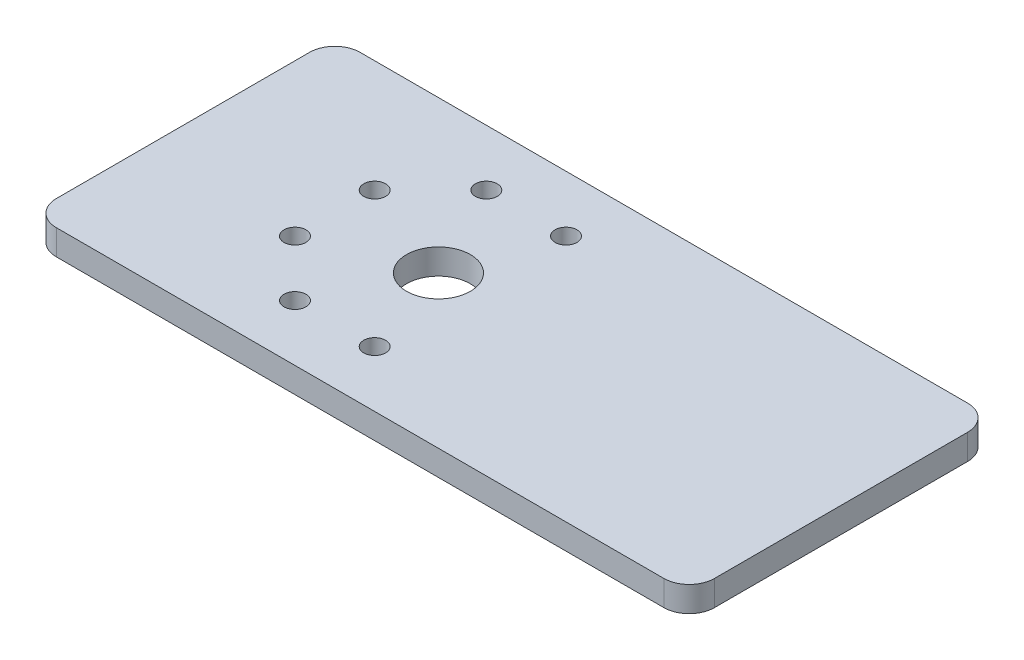
ISO-10303-21;
HEADER;
FILE_DESCRIPTION(('STEP AP214'),'2;1');
FILE_NAME('part.step','',(''),(''),'','','');
FILE_SCHEMA(('AUTOMOTIVE_DESIGN { 1 0 10303 214 1 1 1 1 }'));
ENDSEC;
DATA;
#1=APPLICATION_CONTEXT('core data for automotive mechanical design processes');
#2=APPLICATION_PROTOCOL_DEFINITION('international standard','automotive_design',2000,#1);
#3=PRODUCT_CONTEXT('',#1,'mechanical');
#4=PRODUCT('Part','Part','',(#3));
#5=PRODUCT_RELATED_PRODUCT_CATEGORY('part','',(#4));
#6=PRODUCT_DEFINITION_FORMATION('','',#4);
#7=PRODUCT_DEFINITION_CONTEXT('part definition',#1,'design');
#8=PRODUCT_DEFINITION('design','',#6,#7);
#9=PRODUCT_DEFINITION_SHAPE('','',#8);
#10=(LENGTH_UNIT() NAMED_UNIT(*) SI_UNIT(.MILLI.,.METRE.));
#11=(NAMED_UNIT(*) PLANE_ANGLE_UNIT() SI_UNIT($,.RADIAN.));
#12=(NAMED_UNIT(*) SI_UNIT($,.STERADIAN.) SOLID_ANGLE_UNIT());
#13=UNCERTAINTY_MEASURE_WITH_UNIT(LENGTH_MEASURE(1.E-05),#10,'distance_accuracy_value','');
#14=(GEOMETRIC_REPRESENTATION_CONTEXT(3) GLOBAL_UNCERTAINTY_ASSIGNED_CONTEXT((#13)) GLOBAL_UNIT_ASSIGNED_CONTEXT((#10,
#11,#12)) REPRESENTATION_CONTEXT('',''));
#15=CARTESIAN_POINT('',(0.,0.,0.));
#16=DIRECTION('',(0.,0.,1.));
#17=DIRECTION('',(1.,0.,0.));
#18=AXIS2_PLACEMENT_3D('',#15,#16,#17);
#19=CARTESIAN_POINT('',(82.55,6.35,-38.1));
#20=DIRECTION('',(-1.,0.,0.));
#21=DIRECTION('',(0.,0.,1.));
#22=AXIS2_PLACEMENT_3D('',#19,#20,#21);
#23=PLANE('',#22);
#24=DIRECTION('',(0.,0.,-1.));
#25=VECTOR('',#24,1.);
#26=CARTESIAN_POINT('',(82.55,0.,-38.1));
#27=LINE('',#26,#25);
#28=CARTESIAN_POINT('',(82.55,0.,31.75));
#29=VERTEX_POINT('',#28);
#30=CARTESIAN_POINT('',(82.55,0.,-31.75));
#31=VERTEX_POINT('',#30);
#32=EDGE_CURVE('E127',#29,#31,#27,.T.);
#33=ORIENTED_EDGE('',*,*,#32,.T.);
#34=DIRECTION('',(0.,-1.,0.));
#35=VECTOR('',#34,1.);
#36=CARTESIAN_POINT('',(82.55,6.35,-31.75));
#37=LINE('',#36,#35);
#38=CARTESIAN_POINT('',(82.55,6.35,-31.75));
#39=VERTEX_POINT('',#38);
#40=EDGE_CURVE('E163',#31,#39,#37,.F.);
#41=ORIENTED_EDGE('',*,*,#40,.T.);
#42=DIRECTION('',(0.,0.,-1.));
#43=VECTOR('',#42,1.);
#44=CARTESIAN_POINT('',(82.55,6.35,-38.1));
#45=LINE('',#44,#43);
#46=CARTESIAN_POINT('',(82.55,6.35,31.75));
#47=VERTEX_POINT('',#46);
#48=EDGE_CURVE('E125',#47,#39,#45,.T.);
#49=ORIENTED_EDGE('',*,*,#48,.F.);
#50=DIRECTION('',(0.,-1.,0.));
#51=VECTOR('',#50,1.);
#52=CARTESIAN_POINT('',(82.55,6.35,31.75));
#53=LINE('',#52,#51);
#54=EDGE_CURVE('E160',#47,#29,#53,.T.);
#55=ORIENTED_EDGE('',*,*,#54,.T.);
#56=EDGE_LOOP('',(#33,#41,#49,#55));
#57=FACE_BOUND('',#56,.T.);
#58=ADVANCED_FACE('F32',(#57),#23,.F.);
#59=CARTESIAN_POINT('',(-82.55,6.35,-38.1));
#60=DIRECTION('',(0.,0.,1.));
#61=DIRECTION('',(1.,0.,0.));
#62=AXIS2_PLACEMENT_3D('',#59,#60,#61);
#63=PLANE('',#62);
#64=DIRECTION('',(-1.,0.,0.));
#65=VECTOR('',#64,1.);
#66=CARTESIAN_POINT('',(-82.55,0.,-38.1));
#67=LINE('',#66,#65);
#68=CARTESIAN_POINT('',(76.2,0.,-38.1));
#69=VERTEX_POINT('',#68);
#70=CARTESIAN_POINT('',(-76.2,0.,-38.1));
#71=VERTEX_POINT('',#70);
#72=EDGE_CURVE('E123',#69,#71,#67,.T.);
#73=ORIENTED_EDGE('',*,*,#72,.T.);
#74=DIRECTION('',(0.,-1.,0.));
#75=VECTOR('',#74,1.);
#76=CARTESIAN_POINT('',(-76.2,6.35,-38.1));
#77=LINE('',#76,#75);
#78=CARTESIAN_POINT('',(-76.2,6.35,-38.1));
#79=VERTEX_POINT('',#78);
#80=EDGE_CURVE('E102',#71,#79,#77,.F.);
#81=ORIENTED_EDGE('',*,*,#80,.T.);
#82=DIRECTION('',(-1.,0.,0.));
#83=VECTOR('',#82,1.);
#84=CARTESIAN_POINT('',(-82.55,6.35,-38.1));
#85=LINE('',#84,#83);
#86=CARTESIAN_POINT('',(76.2,6.35,-38.1));
#87=VERTEX_POINT('',#86);
#88=EDGE_CURVE('E179',#87,#79,#85,.T.);
#89=ORIENTED_EDGE('',*,*,#88,.F.);
#90=DIRECTION('',(0.,-1.,0.));
#91=VECTOR('',#90,1.);
#92=CARTESIAN_POINT('',(76.2,6.35,-38.1));
#93=LINE('',#92,#91);
#94=EDGE_CURVE('E107',#87,#69,#93,.T.);
#95=ORIENTED_EDGE('',*,*,#94,.T.);
#96=EDGE_LOOP('',(#73,#81,#89,#95));
#97=FACE_BOUND('',#96,.T.);
#98=ADVANCED_FACE('F246',(#97),#63,.F.);
#99=CARTESIAN_POINT('',(-82.55,6.35,-38.1));
#100=DIRECTION('',(1.,0.,0.));
#101=DIRECTION('',(0.,0.,-1.));
#102=AXIS2_PLACEMENT_3D('',#99,#100,#101);
#103=PLANE('',#102);
#104=DIRECTION('',(0.,0.,1.));
#105=VECTOR('',#104,1.);
#106=CARTESIAN_POINT('',(-82.55,6.35,-38.1));
#107=LINE('',#106,#105);
#108=CARTESIAN_POINT('',(-82.55,6.35,-31.75));
#109=VERTEX_POINT('',#108);
#110=CARTESIAN_POINT('',(-82.55,6.35,31.75));
#111=VERTEX_POINT('',#110);
#112=EDGE_CURVE('E116',#109,#111,#107,.T.);
#113=ORIENTED_EDGE('',*,*,#112,.F.);
#114=DIRECTION('',(0.,-1.,0.));
#115=VECTOR('',#114,1.);
#116=CARTESIAN_POINT('',(-82.55,6.35,-31.75));
#117=LINE('',#116,#115);
#118=CARTESIAN_POINT('',(-82.55,0.,-31.75));
#119=VERTEX_POINT('',#118);
#120=EDGE_CURVE('E101',#109,#119,#117,.T.);
#121=ORIENTED_EDGE('',*,*,#120,.T.);
#122=DIRECTION('',(0.,0.,1.));
#123=VECTOR('',#122,1.);
#124=CARTESIAN_POINT('',(-82.55,0.,-38.1));
#125=LINE('',#124,#123);
#126=CARTESIAN_POINT('',(-82.55,0.,31.75));
#127=VERTEX_POINT('',#126);
#128=EDGE_CURVE('E114',#119,#127,#125,.T.);
#129=ORIENTED_EDGE('',*,*,#128,.T.);
#130=DIRECTION('',(0.,-1.,0.));
#131=VECTOR('',#130,1.);
#132=CARTESIAN_POINT('',(-82.55,6.35,31.75));
#133=LINE('',#132,#131);
#134=EDGE_CURVE('E118',#127,#111,#133,.F.);
#135=ORIENTED_EDGE('',*,*,#134,.T.);
#136=EDGE_LOOP('',(#113,#121,#129,#135));
#137=FACE_BOUND('',#136,.T.);
#138=ADVANCED_FACE('F113',(#137),#103,.F.);
#139=CARTESIAN_POINT('',(-82.55,6.35,38.1));
#140=DIRECTION('',(0.,0.,-1.));
#141=DIRECTION('',(-1.,0.,0.));
#142=AXIS2_PLACEMENT_3D('',#139,#140,#141);
#143=PLANE('',#142);
#144=DIRECTION('',(1.,0.,0.));
#145=VECTOR('',#144,1.);
#146=CARTESIAN_POINT('',(-82.55,0.,38.1));
#147=LINE('',#146,#145);
#148=CARTESIAN_POINT('',(-76.2,0.,38.1));
#149=VERTEX_POINT('',#148);
#150=CARTESIAN_POINT('',(76.2,0.,38.1));
#151=VERTEX_POINT('',#150);
#152=EDGE_CURVE('E122',#149,#151,#147,.T.);
#153=ORIENTED_EDGE('',*,*,#152,.T.);
#154=DIRECTION('',(0.,-1.,0.));
#155=VECTOR('',#154,1.);
#156=CARTESIAN_POINT('',(76.2,6.35,38.1));
#157=LINE('',#156,#155);
#158=CARTESIAN_POINT('',(76.2,6.35,38.1));
#159=VERTEX_POINT('',#158);
#160=EDGE_CURVE('E11',#151,#159,#157,.F.);
#161=ORIENTED_EDGE('',*,*,#160,.T.);
#162=DIRECTION('',(1.,0.,0.));
#163=VECTOR('',#162,1.);
#164=CARTESIAN_POINT('',(-82.55,6.35,38.1));
#165=LINE('',#164,#163);
#166=CARTESIAN_POINT('',(-76.2,6.35,38.1));
#167=VERTEX_POINT('',#166);
#168=EDGE_CURVE('E144',#167,#159,#165,.T.);
#169=ORIENTED_EDGE('',*,*,#168,.F.);
#170=DIRECTION('',(0.,-1.,0.));
#171=VECTOR('',#170,1.);
#172=CARTESIAN_POINT('',(-76.2,6.35,38.1));
#173=LINE('',#172,#171);
#174=EDGE_CURVE('E40',#167,#149,#173,.T.);
#175=ORIENTED_EDGE('',*,*,#174,.T.);
#176=EDGE_LOOP('',(#153,#161,#169,#175));
#177=FACE_BOUND('',#176,.T.);
#178=ADVANCED_FACE('F166',(#177),#143,.F.);
#179=CARTESIAN_POINT('',(0.,6.35,0.));
#180=DIRECTION('',(0.,1.,0.));
#181=DIRECTION('',(0.,0.,1.));
#182=AXIS2_PLACEMENT_3D('',#179,#180,#181);
#183=PLANE('',#182);
#184=CARTESIAN_POINT('',(-18.45,6.35,0.));
#185=DIRECTION('',(0.,1.,0.));
#186=DIRECTION('',(0.,0.,1.));
#187=AXIS2_PLACEMENT_3D('',#184,#185,#186);
#188=CIRCLE('',#187,8.);
#189=CARTESIAN_POINT('',(-18.45,6.35,8.));
#190=VERTEX_POINT('',#189);
#191=EDGE_CURVE('E214',#190,#190,#188,.T.);
#192=ORIENTED_EDGE('',*,*,#191,.F.);
#193=EDGE_LOOP('',(#192));
#194=FACE_BOUND('',#193,.T.);
#195=CARTESIAN_POINT('',(-44.45,6.35,-10.));
#196=DIRECTION('',(0.,1.,0.));
#197=DIRECTION('',(0.,0.,1.));
#198=AXIS2_PLACEMENT_3D('',#195,#196,#197);
#199=CIRCLE('',#198,2.75);
#200=CARTESIAN_POINT('',(-44.45,6.35,-7.25));
#201=VERTEX_POINT('',#200);
#202=EDGE_CURVE('E210',#201,#201,#199,.T.);
#203=ORIENTED_EDGE('',*,*,#202,.F.);
#204=EDGE_LOOP('',(#203));
#205=FACE_BOUND('',#204,.T.);
#206=CARTESIAN_POINT('',(-44.45,6.35,10.));
#207=DIRECTION('',(0.,1.,0.));
#208=DIRECTION('',(0.,0.,1.));
#209=AXIS2_PLACEMENT_3D('',#206,#207,#208);
#210=CIRCLE('',#209,2.75);
#211=CARTESIAN_POINT('',(-44.45,6.35,12.75));
#212=VERTEX_POINT('',#211);
#213=EDGE_CURVE('E204',#212,#212,#210,.T.);
#214=ORIENTED_EDGE('',*,*,#213,.F.);
#215=EDGE_LOOP('',(#214));
#216=FACE_BOUND('',#215,.T.);
#217=CARTESIAN_POINT('',(-10.45,6.35,-23.999999994));
#218=DIRECTION('',(0.,1.,0.));
#219=DIRECTION('',(0.,0.,1.));
#220=AXIS2_PLACEMENT_3D('',#217,#218,#219);
#221=CIRCLE('',#220,2.75);
#222=CARTESIAN_POINT('',(-10.45,6.35,-21.249999994));
#223=VERTEX_POINT('',#222);
#224=EDGE_CURVE('E143',#223,#223,#221,.T.);
#225=ORIENTED_EDGE('',*,*,#224,.F.);
#226=EDGE_LOOP('',(#225));
#227=FACE_BOUND('',#226,.T.);
#228=CARTESIAN_POINT('',(-10.45,6.35,24.000000006));
#229=DIRECTION('',(0.,1.,0.));
#230=DIRECTION('',(0.,0.,1.));
#231=AXIS2_PLACEMENT_3D('',#228,#229,#230);
#232=CIRCLE('',#231,2.75);
#233=CARTESIAN_POINT('',(-10.45,6.35,26.750000006));
#234=VERTEX_POINT('',#233);
#235=EDGE_CURVE('E139',#234,#234,#232,.T.);
#236=ORIENTED_EDGE('',*,*,#235,.F.);
#237=EDGE_LOOP('',(#236));
#238=FACE_BOUND('',#237,.T.);
#239=CARTESIAN_POINT('',(-30.45,6.35,-23.999999994));
#240=DIRECTION('',(0.,1.,0.));
#241=DIRECTION('',(0.,0.,1.));
#242=AXIS2_PLACEMENT_3D('',#239,#240,#241);
#243=CIRCLE('',#242,2.75);
#244=CARTESIAN_POINT('',(-30.45,6.35,-21.249999994));
#245=VERTEX_POINT('',#244);
#246=EDGE_CURVE('E135',#245,#245,#243,.T.);
#247=ORIENTED_EDGE('',*,*,#246,.F.);
#248=EDGE_LOOP('',(#247));
#249=FACE_BOUND('',#248,.T.);
#250=CARTESIAN_POINT('',(-30.45,6.35,24.000000006));
#251=DIRECTION('',(0.,1.,0.));
#252=DIRECTION('',(0.,0.,1.));
#253=AXIS2_PLACEMENT_3D('',#250,#251,#252);
#254=CIRCLE('',#253,2.75);
#255=CARTESIAN_POINT('',(-30.45,6.35,26.750000006));
#256=VERTEX_POINT('',#255);
#257=EDGE_CURVE('E134',#256,#256,#254,.T.);
#258=ORIENTED_EDGE('',*,*,#257,.F.);
#259=EDGE_LOOP('',(#258));
#260=FACE_BOUND('',#259,.T.);
#261=ORIENTED_EDGE('',*,*,#88,.T.);
#262=CARTESIAN_POINT('',(-76.2,6.35,-31.75));
#263=DIRECTION('',(0.,1.,0.));
#264=DIRECTION('',(0.,0.,1.));
#265=AXIS2_PLACEMENT_3D('',#262,#263,#264);
#266=CIRCLE('',#265,6.35);
#267=EDGE_CURVE('E158',#79,#109,#266,.T.);
#268=ORIENTED_EDGE('',*,*,#267,.T.);
#269=ORIENTED_EDGE('',*,*,#112,.T.);
#270=CARTESIAN_POINT('',(-76.2,6.35,31.75));
#271=DIRECTION('',(0.,1.,0.));
#272=DIRECTION('',(0.,0.,1.));
#273=AXIS2_PLACEMENT_3D('',#270,#271,#272);
#274=CIRCLE('',#273,6.35);
#275=EDGE_CURVE('E52',#111,#167,#274,.T.);
#276=ORIENTED_EDGE('',*,*,#275,.T.);
#277=ORIENTED_EDGE('',*,*,#168,.T.);
#278=CARTESIAN_POINT('',(76.2,6.35,31.75));
#279=DIRECTION('',(0.,1.,0.));
#280=DIRECTION('',(0.,0.,1.));
#281=AXIS2_PLACEMENT_3D('',#278,#279,#280);
#282=CIRCLE('',#281,6.35);
#283=EDGE_CURVE('E154',#159,#47,#282,.T.);
#284=ORIENTED_EDGE('',*,*,#283,.T.);
#285=ORIENTED_EDGE('',*,*,#48,.T.);
#286=CARTESIAN_POINT('',(76.2,6.35,-31.75));
#287=DIRECTION('',(0.,1.,0.));
#288=DIRECTION('',(0.,0.,1.));
#289=AXIS2_PLACEMENT_3D('',#286,#287,#288);
#290=CIRCLE('',#289,6.35);
#291=EDGE_CURVE('E156',#39,#87,#290,.T.);
#292=ORIENTED_EDGE('',*,*,#291,.T.);
#293=EDGE_LOOP('',(#261,#268,#269,#276,#277,#284,#285,#292));
#294=FACE_BOUND('',#293,.T.);
#295=ADVANCED_FACE('F229',(#194,#205,#216,#227,#238,#249,#260,#294),#183,.T.);
#296=CARTESIAN_POINT('',(0.,0.,0.));
#297=DIRECTION('',(0.,1.,0.));
#298=DIRECTION('',(0.,0.,1.));
#299=AXIS2_PLACEMENT_3D('',#296,#297,#298);
#300=PLANE('',#299);
#301=CARTESIAN_POINT('',(-18.45,0.,0.));
#302=DIRECTION('',(0.,1.,0.));
#303=DIRECTION('',(0.,0.,1.));
#304=AXIS2_PLACEMENT_3D('',#301,#302,#303);
#305=CIRCLE('',#304,8.);
#306=CARTESIAN_POINT('',(-18.45,0.,8.));
#307=VERTEX_POINT('',#306);
#308=EDGE_CURVE('E213',#307,#307,#305,.T.);
#309=ORIENTED_EDGE('',*,*,#308,.T.);
#310=EDGE_LOOP('',(#309));
#311=FACE_BOUND('',#310,.T.);
#312=CARTESIAN_POINT('',(-44.45,0.,-10.));
#313=DIRECTION('',(0.,1.,0.));
#314=DIRECTION('',(0.,0.,1.));
#315=AXIS2_PLACEMENT_3D('',#312,#313,#314);
#316=CIRCLE('',#315,2.75);
#317=CARTESIAN_POINT('',(-44.45,0.,-7.25));
#318=VERTEX_POINT('',#317);
#319=EDGE_CURVE('E207',#318,#318,#316,.T.);
#320=ORIENTED_EDGE('',*,*,#319,.T.);
#321=EDGE_LOOP('',(#320));
#322=FACE_BOUND('',#321,.T.);
#323=CARTESIAN_POINT('',(-44.45,0.,10.));
#324=DIRECTION('',(0.,1.,0.));
#325=DIRECTION('',(0.,0.,1.));
#326=AXIS2_PLACEMENT_3D('',#323,#324,#325);
#327=CIRCLE('',#326,2.75);
#328=CARTESIAN_POINT('',(-44.45,0.,12.75));
#329=VERTEX_POINT('',#328);
#330=EDGE_CURVE('E201',#329,#329,#327,.T.);
#331=ORIENTED_EDGE('',*,*,#330,.T.);
#332=EDGE_LOOP('',(#331));
#333=FACE_BOUND('',#332,.T.);
#334=CARTESIAN_POINT('',(-10.45,0.,-23.999999994));
#335=DIRECTION('',(0.,1.,0.));
#336=DIRECTION('',(0.,0.,1.));
#337=AXIS2_PLACEMENT_3D('',#334,#335,#336);
#338=CIRCLE('',#337,2.75);
#339=CARTESIAN_POINT('',(-10.45,0.,-21.249999994));
#340=VERTEX_POINT('',#339);
#341=EDGE_CURVE('E140',#340,#340,#338,.T.);
#342=ORIENTED_EDGE('',*,*,#341,.T.);
#343=EDGE_LOOP('',(#342));
#344=FACE_BOUND('',#343,.T.);
#345=CARTESIAN_POINT('',(-10.45,0.,24.000000006));
#346=DIRECTION('',(0.,1.,0.));
#347=DIRECTION('',(0.,0.,1.));
#348=AXIS2_PLACEMENT_3D('',#345,#346,#347);
#349=CIRCLE('',#348,2.75);
#350=CARTESIAN_POINT('',(-10.45,0.,26.750000006));
#351=VERTEX_POINT('',#350);
#352=EDGE_CURVE('E136',#351,#351,#349,.T.);
#353=ORIENTED_EDGE('',*,*,#352,.T.);
#354=EDGE_LOOP('',(#353));
#355=FACE_BOUND('',#354,.T.);
#356=CARTESIAN_POINT('',(-30.45,0.,-23.999999994));
#357=DIRECTION('',(0.,1.,0.));
#358=DIRECTION('',(0.,0.,1.));
#359=AXIS2_PLACEMENT_3D('',#356,#357,#358);
#360=CIRCLE('',#359,2.75);
#361=CARTESIAN_POINT('',(-30.45,0.,-21.249999994));
#362=VERTEX_POINT('',#361);
#363=EDGE_CURVE('E131',#362,#362,#360,.T.);
#364=ORIENTED_EDGE('',*,*,#363,.T.);
#365=EDGE_LOOP('',(#364));
#366=FACE_BOUND('',#365,.T.);
#367=CARTESIAN_POINT('',(-30.45,0.,24.000000006));
#368=DIRECTION('',(0.,1.,0.));
#369=DIRECTION('',(0.,0.,1.));
#370=AXIS2_PLACEMENT_3D('',#367,#368,#369);
#371=CIRCLE('',#370,2.75);
#372=CARTESIAN_POINT('',(-30.45,0.,26.750000006));
#373=VERTEX_POINT('',#372);
#374=EDGE_CURVE('E184',#373,#373,#371,.T.);
#375=ORIENTED_EDGE('',*,*,#374,.T.);
#376=EDGE_LOOP('',(#375));
#377=FACE_BOUND('',#376,.T.);
#378=ORIENTED_EDGE('',*,*,#128,.F.);
#379=CARTESIAN_POINT('',(-76.2,0.,-31.75));
#380=DIRECTION('',(0.,1.,0.));
#381=DIRECTION('',(0.,0.,1.));
#382=AXIS2_PLACEMENT_3D('',#379,#380,#381);
#383=CIRCLE('',#382,6.35);
#384=EDGE_CURVE('E97',#119,#71,#383,.F.);
#385=ORIENTED_EDGE('',*,*,#384,.T.);
#386=ORIENTED_EDGE('',*,*,#72,.F.);
#387=CARTESIAN_POINT('',(76.2,0.,-31.75));
#388=DIRECTION('',(0.,1.,0.));
#389=DIRECTION('',(0.,0.,1.));
#390=AXIS2_PLACEMENT_3D('',#387,#388,#389);
#391=CIRCLE('',#390,6.35);
#392=EDGE_CURVE('E108',#69,#31,#391,.F.);
#393=ORIENTED_EDGE('',*,*,#392,.T.);
#394=ORIENTED_EDGE('',*,*,#32,.F.);
#395=CARTESIAN_POINT('',(76.2,0.,31.75));
#396=DIRECTION('',(0.,1.,0.));
#397=DIRECTION('',(0.,0.,1.));
#398=AXIS2_PLACEMENT_3D('',#395,#396,#397);
#399=CIRCLE('',#398,6.35);
#400=EDGE_CURVE('E147',#29,#151,#399,.F.);
#401=ORIENTED_EDGE('',*,*,#400,.T.);
#402=ORIENTED_EDGE('',*,*,#152,.F.);
#403=CARTESIAN_POINT('',(-76.2,0.,31.75));
#404=DIRECTION('',(0.,1.,0.));
#405=DIRECTION('',(0.,0.,1.));
#406=AXIS2_PLACEMENT_3D('',#403,#404,#405);
#407=CIRCLE('',#406,6.35);
#408=EDGE_CURVE('E117',#149,#127,#407,.F.);
#409=ORIENTED_EDGE('',*,*,#408,.T.);
#410=EDGE_LOOP('',(#378,#385,#386,#393,#394,#401,#402,#409));
#411=FACE_BOUND('',#410,.T.);
#412=ADVANCED_FACE('F120',(#311,#322,#333,#344,#355,#366,#377,#411),#300,.F.);
#413=CARTESIAN_POINT('',(-30.45,6.35,24.000000006));
#414=DIRECTION('',(0.,1.,0.));
#415=DIRECTION('',(0.,0.,1.));
#416=AXIS2_PLACEMENT_3D('',#413,#414,#415);
#417=CYLINDRICAL_SURFACE('',#416,2.75);
#418=ORIENTED_EDGE('',*,*,#257,.T.);
#419=EDGE_LOOP('',(#418));
#420=FACE_BOUND('',#419,.T.);
#421=ORIENTED_EDGE('',*,*,#374,.F.);
#422=EDGE_LOOP('',(#421));
#423=FACE_BOUND('',#422,.T.);
#424=ADVANCED_FACE('F268',(#420,#423),#417,.F.);
#425=CARTESIAN_POINT('',(-30.45,6.35,-23.999999994));
#426=DIRECTION('',(0.,1.,0.));
#427=DIRECTION('',(0.,0.,1.));
#428=AXIS2_PLACEMENT_3D('',#425,#426,#427);
#429=CYLINDRICAL_SURFACE('',#428,2.75);
#430=ORIENTED_EDGE('',*,*,#246,.T.);
#431=EDGE_LOOP('',(#430));
#432=FACE_BOUND('',#431,.T.);
#433=ORIENTED_EDGE('',*,*,#363,.F.);
#434=EDGE_LOOP('',(#433));
#435=FACE_BOUND('',#434,.T.);
#436=ADVANCED_FACE('F272',(#432,#435),#429,.F.);
#437=CARTESIAN_POINT('',(-10.45,6.35,24.000000006));
#438=DIRECTION('',(0.,1.,0.));
#439=DIRECTION('',(0.,0.,1.));
#440=AXIS2_PLACEMENT_3D('',#437,#438,#439);
#441=CYLINDRICAL_SURFACE('',#440,2.75);
#442=ORIENTED_EDGE('',*,*,#235,.T.);
#443=EDGE_LOOP('',(#442));
#444=FACE_BOUND('',#443,.T.);
#445=ORIENTED_EDGE('',*,*,#352,.F.);
#446=EDGE_LOOP('',(#445));
#447=FACE_BOUND('',#446,.T.);
#448=ADVANCED_FACE('F275',(#444,#447),#441,.F.);
#449=CARTESIAN_POINT('',(-10.45,6.35,-23.999999994));
#450=DIRECTION('',(0.,1.,0.));
#451=DIRECTION('',(0.,0.,1.));
#452=AXIS2_PLACEMENT_3D('',#449,#450,#451);
#453=CYLINDRICAL_SURFACE('',#452,2.75);
#454=ORIENTED_EDGE('',*,*,#224,.T.);
#455=EDGE_LOOP('',(#454));
#456=FACE_BOUND('',#455,.T.);
#457=ORIENTED_EDGE('',*,*,#341,.F.);
#458=EDGE_LOOP('',(#457));
#459=FACE_BOUND('',#458,.T.);
#460=ADVANCED_FACE('F279',(#456,#459),#453,.F.);
#461=CARTESIAN_POINT('',(-44.45,6.35,10.));
#462=DIRECTION('',(0.,1.,0.));
#463=DIRECTION('',(0.,0.,1.));
#464=AXIS2_PLACEMENT_3D('',#461,#462,#463);
#465=CYLINDRICAL_SURFACE('',#464,2.75);
#466=ORIENTED_EDGE('',*,*,#213,.T.);
#467=EDGE_LOOP('',(#466));
#468=FACE_BOUND('',#467,.T.);
#469=ORIENTED_EDGE('',*,*,#330,.F.);
#470=EDGE_LOOP('',(#469));
#471=FACE_BOUND('',#470,.T.);
#472=ADVANCED_FACE('F283',(#468,#471),#465,.F.);
#473=CARTESIAN_POINT('',(-44.45,6.35,-10.));
#474=DIRECTION('',(0.,1.,0.));
#475=DIRECTION('',(0.,0.,1.));
#476=AXIS2_PLACEMENT_3D('',#473,#474,#475);
#477=CYLINDRICAL_SURFACE('',#476,2.75);
#478=ORIENTED_EDGE('',*,*,#202,.T.);
#479=EDGE_LOOP('',(#478));
#480=FACE_BOUND('',#479,.T.);
#481=ORIENTED_EDGE('',*,*,#319,.F.);
#482=EDGE_LOOP('',(#481));
#483=FACE_BOUND('',#482,.T.);
#484=ADVANCED_FACE('F225',(#480,#483),#477,.F.);
#485=CARTESIAN_POINT('',(-18.45,0.,0.));
#486=DIRECTION('',(0.,1.,0.));
#487=DIRECTION('',(0.,0.,1.));
#488=AXIS2_PLACEMENT_3D('',#485,#486,#487);
#489=CYLINDRICAL_SURFACE('',#488,8.);
#490=ORIENTED_EDGE('',*,*,#308,.F.);
#491=EDGE_LOOP('',(#490));
#492=FACE_BOUND('',#491,.T.);
#493=ORIENTED_EDGE('',*,*,#191,.T.);
#494=EDGE_LOOP('',(#493));
#495=FACE_BOUND('',#494,.T.);
#496=ADVANCED_FACE('F222',(#492,#495),#489,.F.);
#497=CARTESIAN_POINT('',(-76.2,6.35,-31.75));
#498=DIRECTION('',(0.,-1.,0.));
#499=DIRECTION('',(0.,0.,-1.));
#500=AXIS2_PLACEMENT_3D('',#497,#498,#499);
#501=CYLINDRICAL_SURFACE('',#500,6.35);
#502=ORIENTED_EDGE('',*,*,#267,.F.);
#503=ORIENTED_EDGE('',*,*,#80,.F.);
#504=ORIENTED_EDGE('',*,*,#384,.F.);
#505=ORIENTED_EDGE('',*,*,#120,.F.);
#506=EDGE_LOOP('',(#502,#503,#504,#505));
#507=FACE_BOUND('',#506,.T.);
#508=ADVANCED_FACE('F100',(#507),#501,.T.);
#509=CARTESIAN_POINT('',(76.2,6.35,-31.75));
#510=DIRECTION('',(0.,-1.,0.));
#511=DIRECTION('',(0.,0.,-1.));
#512=AXIS2_PLACEMENT_3D('',#509,#510,#511);
#513=CYLINDRICAL_SURFACE('',#512,6.35);
#514=ORIENTED_EDGE('',*,*,#291,.F.);
#515=ORIENTED_EDGE('',*,*,#40,.F.);
#516=ORIENTED_EDGE('',*,*,#392,.F.);
#517=ORIENTED_EDGE('',*,*,#94,.F.);
#518=EDGE_LOOP('',(#514,#515,#516,#517));
#519=FACE_BOUND('',#518,.T.);
#520=ADVANCED_FACE('F248',(#519),#513,.T.);
#521=CARTESIAN_POINT('',(76.2,6.35,31.75));
#522=DIRECTION('',(0.,-1.,0.));
#523=DIRECTION('',(0.,0.,-1.));
#524=AXIS2_PLACEMENT_3D('',#521,#522,#523);
#525=CYLINDRICAL_SURFACE('',#524,6.35);
#526=ORIENTED_EDGE('',*,*,#283,.F.);
#527=ORIENTED_EDGE('',*,*,#160,.F.);
#528=ORIENTED_EDGE('',*,*,#400,.F.);
#529=ORIENTED_EDGE('',*,*,#54,.F.);
#530=EDGE_LOOP('',(#526,#527,#528,#529));
#531=FACE_BOUND('',#530,.T.);
#532=ADVANCED_FACE('F173',(#531),#525,.T.);
#533=CARTESIAN_POINT('',(-76.2,6.35,31.75));
#534=DIRECTION('',(0.,-1.,0.));
#535=DIRECTION('',(0.,0.,-1.));
#536=AXIS2_PLACEMENT_3D('',#533,#534,#535);
#537=CYLINDRICAL_SURFACE('',#536,6.35);
#538=ORIENTED_EDGE('',*,*,#275,.F.);
#539=ORIENTED_EDGE('',*,*,#134,.F.);
#540=ORIENTED_EDGE('',*,*,#408,.F.);
#541=ORIENTED_EDGE('',*,*,#174,.F.);
#542=EDGE_LOOP('',(#538,#539,#540,#541));
#543=FACE_BOUND('',#542,.T.);
#544=ADVANCED_FACE('F34',(#543),#537,.T.);
#545=CLOSED_SHELL('',(#58,#98,#138,#178,#295,#412,#424,#436,#448,#460,#472,#484,#496,#508,#520,
#532,#544));
#546=MANIFOLD_SOLID_BREP('B2',#545);
#547=ADVANCED_BREP_SHAPE_REPRESENTATION('',(#18,#546),#14);
#548=SHAPE_DEFINITION_REPRESENTATION(#9,#547);
ENDSEC;
END-ISO-10303-21;
